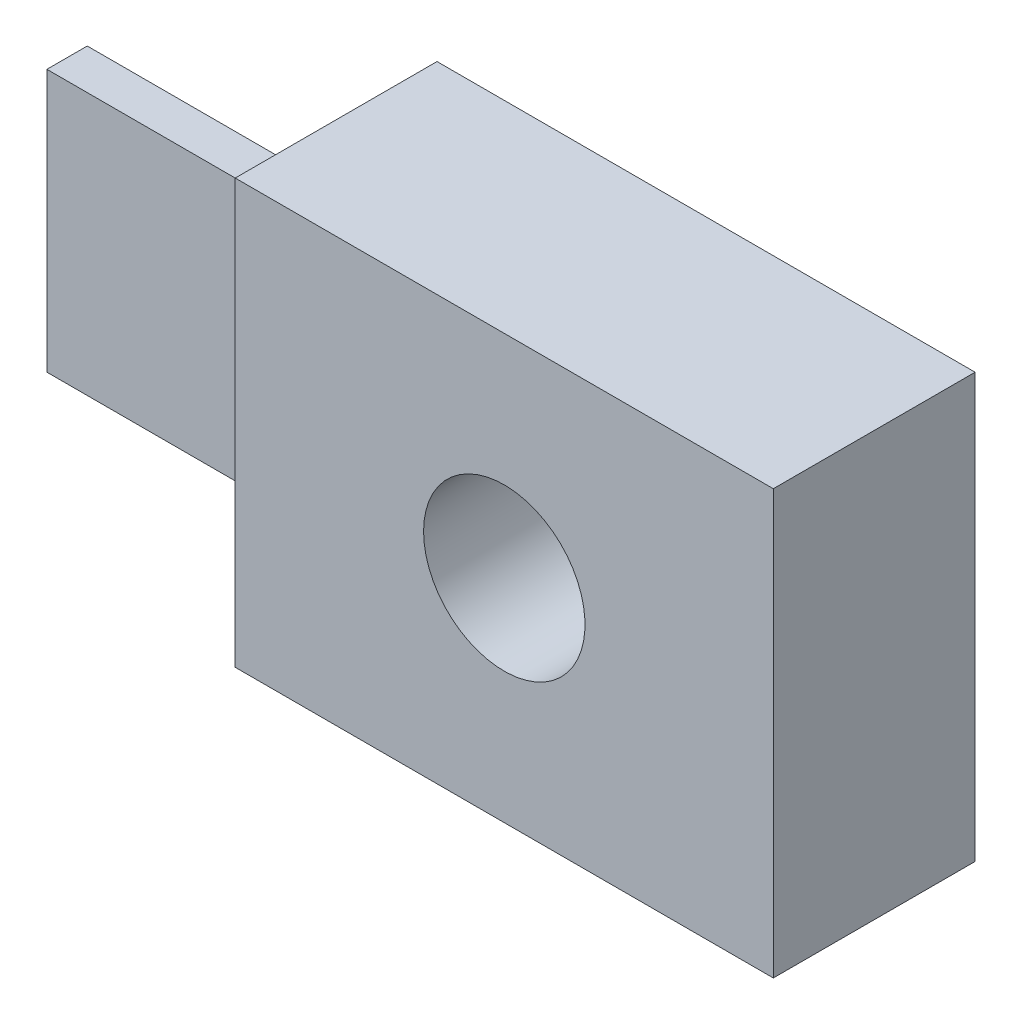
ISO-10303-21;
HEADER;
FILE_DESCRIPTION(('STEP AP214'),'2;1');
FILE_NAME('part.step','',(''),(''),'','','');
FILE_SCHEMA(('AUTOMOTIVE_DESIGN { 1 0 10303 214 1 1 1 1 }'));
ENDSEC;
DATA;
#1=APPLICATION_CONTEXT('core data for automotive mechanical design processes');
#2=APPLICATION_PROTOCOL_DEFINITION('international standard','automotive_design',2000,#1);
#3=PRODUCT_CONTEXT('',#1,'mechanical');
#4=PRODUCT('Part','Part','',(#3));
#5=PRODUCT_RELATED_PRODUCT_CATEGORY('part','',(#4));
#6=PRODUCT_DEFINITION_FORMATION('','',#4);
#7=PRODUCT_DEFINITION_CONTEXT('part definition',#1,'design');
#8=PRODUCT_DEFINITION('design','',#6,#7);
#9=PRODUCT_DEFINITION_SHAPE('','',#8);
#10=(LENGTH_UNIT() NAMED_UNIT(*) SI_UNIT(.MILLI.,.METRE.));
#11=(NAMED_UNIT(*) PLANE_ANGLE_UNIT() SI_UNIT($,.RADIAN.));
#12=(NAMED_UNIT(*) SI_UNIT($,.STERADIAN.) SOLID_ANGLE_UNIT());
#13=UNCERTAINTY_MEASURE_WITH_UNIT(LENGTH_MEASURE(1.E-05),#10,'distance_accuracy_value','');
#14=(GEOMETRIC_REPRESENTATION_CONTEXT(3) GLOBAL_UNCERTAINTY_ASSIGNED_CONTEXT((#13)) GLOBAL_UNIT_ASSIGNED_CONTEXT((#10,
#11,#12)) REPRESENTATION_CONTEXT('',''));
#15=CARTESIAN_POINT('',(0.,0.,0.));
#16=DIRECTION('',(0.,0.,1.));
#17=DIRECTION('',(1.,0.,0.));
#18=AXIS2_PLACEMENT_3D('',#15,#16,#17);
#19=CARTESIAN_POINT('',(-20.,-15.75,15.));
#20=DIRECTION('',(1.,0.,0.));
#21=DIRECTION('',(0.,0.,-1.));
#22=AXIS2_PLACEMENT_3D('',#19,#20,#21);
#23=PLANE('',#22);
#24=DIRECTION('',(0.,-1.,0.));
#25=VECTOR('',#24,1.);
#26=CARTESIAN_POINT('',(-20.,-15.75,0.));
#27=LINE('',#26,#25);
#28=CARTESIAN_POINT('',(-20.,15.75,0.));
#29=VERTEX_POINT('',#28);
#30=CARTESIAN_POINT('',(-20.,-15.75,0.));
#31=VERTEX_POINT('',#30);
#32=EDGE_CURVE('E144',#29,#31,#27,.T.);
#33=ORIENTED_EDGE('',*,*,#32,.T.);
#34=DIRECTION('',(0.,0.,-1.));
#35=VECTOR('',#34,1.);
#36=CARTESIAN_POINT('',(-20.,-15.75,15.));
#37=LINE('',#36,#35);
#38=CARTESIAN_POINT('',(-20.,-15.75,15.));
#39=VERTEX_POINT('',#38);
#40=EDGE_CURVE('E149',#39,#31,#37,.T.);
#41=ORIENTED_EDGE('',*,*,#40,.F.);
#42=DIRECTION('',(0.,-1.,0.));
#43=VECTOR('',#42,1.);
#44=CARTESIAN_POINT('',(-20.,-15.75,15.));
#45=LINE('',#44,#43);
#46=CARTESIAN_POINT('',(-20.,15.75,15.));
#47=VERTEX_POINT('',#46);
#48=EDGE_CURVE('E138',#47,#39,#45,.T.);
#49=ORIENTED_EDGE('',*,*,#48,.F.);
#50=DIRECTION('',(0.,0.,-1.));
#51=VECTOR('',#50,1.);
#52=CARTESIAN_POINT('',(-20.,15.75,15.));
#53=LINE('',#52,#51);
#54=EDGE_CURVE('E45',#47,#29,#53,.T.);
#55=ORIENTED_EDGE('',*,*,#54,.T.);
#56=EDGE_LOOP('',(#33,#41,#49,#55));
#57=FACE_BOUND('',#56,.T.);
#58=DIRECTION('',(0.,1.,0.));
#59=VECTOR('',#58,1.);
#60=CARTESIAN_POINT('',(-20.,-9.75,9.));
#61=LINE('',#60,#59);
#62=CARTESIAN_POINT('',(-20.,-9.75,9.));
#63=VERTEX_POINT('',#62);
#64=CARTESIAN_POINT('',(-20.,9.75,9.));
#65=VERTEX_POINT('',#64);
#66=EDGE_CURVE('E122',#63,#65,#61,.T.);
#67=ORIENTED_EDGE('',*,*,#66,.F.);
#68=DIRECTION('',(0.,0.,1.));
#69=VECTOR('',#68,1.);
#70=CARTESIAN_POINT('',(-20.,-9.75,6.));
#71=LINE('',#70,#69);
#72=CARTESIAN_POINT('',(-20.,-9.75,6.));
#73=VERTEX_POINT('',#72);
#74=EDGE_CURVE('E119',#73,#63,#71,.T.);
#75=ORIENTED_EDGE('',*,*,#74,.F.);
#76=DIRECTION('',(0.,-1.,0.));
#77=VECTOR('',#76,1.);
#78=CARTESIAN_POINT('',(-20.,-9.75,6.));
#79=LINE('',#78,#77);
#80=CARTESIAN_POINT('',(-20.,9.75,6.));
#81=VERTEX_POINT('',#80);
#82=EDGE_CURVE('E57',#81,#73,#79,.T.);
#83=ORIENTED_EDGE('',*,*,#82,.F.);
#84=DIRECTION('',(0.,0.,-1.));
#85=VECTOR('',#84,1.);
#86=CARTESIAN_POINT('',(-20.,9.75,6.));
#87=LINE('',#86,#85);
#88=EDGE_CURVE('E52',#65,#81,#87,.T.);
#89=ORIENTED_EDGE('',*,*,#88,.F.);
#90=EDGE_LOOP('',(#67,#75,#83,#89));
#91=FACE_BOUND('',#90,.T.);
#92=ADVANCED_FACE('F37',(#57,#91),#23,.F.);
#93=CARTESIAN_POINT('',(20.,-15.75,15.));
#94=DIRECTION('',(-1.,0.,0.));
#95=DIRECTION('',(0.,0.,1.));
#96=AXIS2_PLACEMENT_3D('',#93,#94,#95);
#97=PLANE('',#96);
#98=DIRECTION('',(0.,1.,0.));
#99=VECTOR('',#98,1.);
#100=CARTESIAN_POINT('',(20.,-15.75,0.));
#101=LINE('',#100,#99);
#102=CARTESIAN_POINT('',(20.,-15.75,0.));
#103=VERTEX_POINT('',#102);
#104=CARTESIAN_POINT('',(20.,15.75,0.));
#105=VERTEX_POINT('',#104);
#106=EDGE_CURVE('E123',#103,#105,#101,.T.);
#107=ORIENTED_EDGE('',*,*,#106,.T.);
#108=DIRECTION('',(0.,0.,-1.));
#109=VECTOR('',#108,1.);
#110=CARTESIAN_POINT('',(20.,15.75,15.));
#111=LINE('',#110,#109);
#112=CARTESIAN_POINT('',(20.,15.75,15.));
#113=VERTEX_POINT('',#112);
#114=EDGE_CURVE('E11',#113,#105,#111,.T.);
#115=ORIENTED_EDGE('',*,*,#114,.F.);
#116=DIRECTION('',(0.,1.,0.));
#117=VECTOR('',#116,1.);
#118=CARTESIAN_POINT('',(20.,-15.75,15.));
#119=LINE('',#118,#117);
#120=CARTESIAN_POINT('',(20.,-15.75,15.));
#121=VERTEX_POINT('',#120);
#122=EDGE_CURVE('E132',#121,#113,#119,.T.);
#123=ORIENTED_EDGE('',*,*,#122,.F.);
#124=DIRECTION('',(0.,0.,-1.));
#125=VECTOR('',#124,1.);
#126=CARTESIAN_POINT('',(20.,-15.75,15.));
#127=LINE('',#126,#125);
#128=EDGE_CURVE('E141',#121,#103,#127,.T.);
#129=ORIENTED_EDGE('',*,*,#128,.T.);
#130=EDGE_LOOP('',(#107,#115,#123,#129));
#131=FACE_BOUND('',#130,.T.);
#132=ADVANCED_FACE('F39',(#131),#97,.F.);
#133=CARTESIAN_POINT('',(-20.,15.75,15.));
#134=DIRECTION('',(0.,-1.,0.));
#135=DIRECTION('',(0.,0.,-1.));
#136=AXIS2_PLACEMENT_3D('',#133,#134,#135);
#137=PLANE('',#136);
#138=DIRECTION('',(-1.,0.,0.));
#139=VECTOR('',#138,1.);
#140=CARTESIAN_POINT('',(-20.,15.75,0.));
#141=LINE('',#140,#139);
#142=EDGE_CURVE('E126',#105,#29,#141,.T.);
#143=ORIENTED_EDGE('',*,*,#142,.T.);
#144=ORIENTED_EDGE('',*,*,#54,.F.);
#145=DIRECTION('',(-1.,0.,0.));
#146=VECTOR('',#145,1.);
#147=CARTESIAN_POINT('',(-20.,15.75,15.));
#148=LINE('',#147,#146);
#149=EDGE_CURVE('E135',#113,#47,#148,.T.);
#150=ORIENTED_EDGE('',*,*,#149,.F.);
#151=ORIENTED_EDGE('',*,*,#114,.T.);
#152=EDGE_LOOP('',(#143,#144,#150,#151));
#153=FACE_BOUND('',#152,.T.);
#154=ADVANCED_FACE('F171',(#153),#137,.F.);
#155=CARTESIAN_POINT('',(-20.,-15.75,15.));
#156=DIRECTION('',(0.,1.,0.));
#157=DIRECTION('',(0.,0.,1.));
#158=AXIS2_PLACEMENT_3D('',#155,#156,#157);
#159=PLANE('',#158);
#160=DIRECTION('',(1.,0.,0.));
#161=VECTOR('',#160,1.);
#162=CARTESIAN_POINT('',(-20.,-15.75,0.));
#163=LINE('',#162,#161);
#164=EDGE_CURVE('E136',#31,#103,#163,.T.);
#165=ORIENTED_EDGE('',*,*,#164,.T.);
#166=ORIENTED_EDGE('',*,*,#128,.F.);
#167=DIRECTION('',(1.,0.,0.));
#168=VECTOR('',#167,1.);
#169=CARTESIAN_POINT('',(-20.,-15.75,15.));
#170=LINE('',#169,#168);
#171=EDGE_CURVE('E140',#39,#121,#170,.T.);
#172=ORIENTED_EDGE('',*,*,#171,.F.);
#173=ORIENTED_EDGE('',*,*,#40,.T.);
#174=EDGE_LOOP('',(#165,#166,#172,#173));
#175=FACE_BOUND('',#174,.T.);
#176=ADVANCED_FACE('F164',(#175),#159,.F.);
#177=CARTESIAN_POINT('',(0.,0.,15.));
#178=DIRECTION('',(0.,0.,-1.));
#179=DIRECTION('',(-1.,0.,0.));
#180=AXIS2_PLACEMENT_3D('',#177,#178,#179);
#181=PLANE('',#180);
#182=CARTESIAN_POINT('',(0.,0.,15.));
#183=DIRECTION('',(0.,0.,-1.));
#184=DIRECTION('',(-1.,0.,0.));
#185=AXIS2_PLACEMENT_3D('',#182,#183,#184);
#186=CIRCLE('',#185,6.);
#187=CARTESIAN_POINT('',(-6.,0.,15.));
#188=VERTEX_POINT('',#187);
#189=EDGE_CURVE('E211',#188,#188,#186,.T.);
#190=ORIENTED_EDGE('',*,*,#189,.T.);
#191=EDGE_LOOP('',(#190));
#192=FACE_BOUND('',#191,.T.);
#193=ORIENTED_EDGE('',*,*,#122,.T.);
#194=ORIENTED_EDGE('',*,*,#149,.T.);
#195=ORIENTED_EDGE('',*,*,#48,.T.);
#196=ORIENTED_EDGE('',*,*,#171,.T.);
#197=EDGE_LOOP('',(#193,#194,#195,#196));
#198=FACE_BOUND('',#197,.T.);
#199=ADVANCED_FACE('F170',(#192,#198),#181,.F.);
#200=CARTESIAN_POINT('',(0.,0.,0.));
#201=DIRECTION('',(0.,0.,-1.));
#202=DIRECTION('',(-1.,0.,0.));
#203=AXIS2_PLACEMENT_3D('',#200,#201,#202);
#204=PLANE('',#203);
#205=CARTESIAN_POINT('',(0.,0.,0.));
#206=DIRECTION('',(0.,0.,-1.));
#207=DIRECTION('',(-1.,0.,0.));
#208=AXIS2_PLACEMENT_3D('',#205,#206,#207);
#209=CIRCLE('',#208,6.);
#210=CARTESIAN_POINT('',(-6.,0.,0.));
#211=VERTEX_POINT('',#210);
#212=EDGE_CURVE('E214',#211,#211,#209,.T.);
#213=ORIENTED_EDGE('',*,*,#212,.F.);
#214=EDGE_LOOP('',(#213));
#215=FACE_BOUND('',#214,.T.);
#216=ORIENTED_EDGE('',*,*,#106,.F.);
#217=ORIENTED_EDGE('',*,*,#164,.F.);
#218=ORIENTED_EDGE('',*,*,#32,.F.);
#219=ORIENTED_EDGE('',*,*,#142,.F.);
#220=EDGE_LOOP('',(#216,#217,#218,#219));
#221=FACE_BOUND('',#220,.T.);
#222=ADVANCED_FACE('F161',(#215,#221),#204,.T.);
#223=CARTESIAN_POINT('',(-40.,-9.75,9.));
#224=DIRECTION('',(0.,0.,-1.));
#225=DIRECTION('',(-1.,0.,0.));
#226=AXIS2_PLACEMENT_3D('',#223,#224,#225);
#227=PLANE('',#226);
#228=ORIENTED_EDGE('',*,*,#66,.T.);
#229=DIRECTION('',(1.,0.,0.));
#230=VECTOR('',#229,1.);
#231=CARTESIAN_POINT('',(-40.,9.75,9.));
#232=LINE('',#231,#230);
#233=CARTESIAN_POINT('',(-40.,9.75,9.));
#234=VERTEX_POINT('',#233);
#235=EDGE_CURVE('E103',#234,#65,#232,.T.);
#236=ORIENTED_EDGE('',*,*,#235,.F.);
#237=DIRECTION('',(0.,1.,0.));
#238=VECTOR('',#237,1.);
#239=CARTESIAN_POINT('',(-40.,-9.75,9.));
#240=LINE('',#239,#238);
#241=CARTESIAN_POINT('',(-40.,-9.75,9.));
#242=VERTEX_POINT('',#241);
#243=EDGE_CURVE('E110',#242,#234,#240,.T.);
#244=ORIENTED_EDGE('',*,*,#243,.F.);
#245=DIRECTION('',(1.,0.,0.));
#246=VECTOR('',#245,1.);
#247=CARTESIAN_POINT('',(-40.,-9.75,9.));
#248=LINE('',#247,#246);
#249=EDGE_CURVE('E220',#242,#63,#248,.T.);
#250=ORIENTED_EDGE('',*,*,#249,.T.);
#251=EDGE_LOOP('',(#228,#236,#244,#250));
#252=FACE_BOUND('',#251,.T.);
#253=ADVANCED_FACE('F121',(#252),#227,.F.);
#254=CARTESIAN_POINT('',(-40.,9.75,6.));
#255=DIRECTION('',(0.,-1.,0.));
#256=DIRECTION('',(0.,0.,-1.));
#257=AXIS2_PLACEMENT_3D('',#254,#255,#256);
#258=PLANE('',#257);
#259=ORIENTED_EDGE('',*,*,#88,.T.);
#260=DIRECTION('',(1.,0.,0.));
#261=VECTOR('',#260,1.);
#262=CARTESIAN_POINT('',(-40.,9.75,6.));
#263=LINE('',#262,#261);
#264=CARTESIAN_POINT('',(-40.,9.75,6.));
#265=VERTEX_POINT('',#264);
#266=EDGE_CURVE('E106',#265,#81,#263,.T.);
#267=ORIENTED_EDGE('',*,*,#266,.F.);
#268=DIRECTION('',(0.,0.,-1.));
#269=VECTOR('',#268,1.);
#270=CARTESIAN_POINT('',(-40.,9.75,6.));
#271=LINE('',#270,#269);
#272=EDGE_CURVE('E99',#234,#265,#271,.T.);
#273=ORIENTED_EDGE('',*,*,#272,.F.);
#274=ORIENTED_EDGE('',*,*,#235,.T.);
#275=EDGE_LOOP('',(#259,#267,#273,#274));
#276=FACE_BOUND('',#275,.T.);
#277=ADVANCED_FACE('F101',(#276),#258,.F.);
#278=CARTESIAN_POINT('',(-40.,-9.75,6.));
#279=DIRECTION('',(0.,0.,1.));
#280=DIRECTION('',(1.,0.,0.));
#281=AXIS2_PLACEMENT_3D('',#278,#279,#280);
#282=PLANE('',#281);
#283=ORIENTED_EDGE('',*,*,#82,.T.);
#284=DIRECTION('',(1.,0.,0.));
#285=VECTOR('',#284,1.);
#286=CARTESIAN_POINT('',(-40.,-9.75,6.));
#287=LINE('',#286,#285);
#288=CARTESIAN_POINT('',(-40.,-9.75,6.));
#289=VERTEX_POINT('',#288);
#290=EDGE_CURVE('E128',#289,#73,#287,.T.);
#291=ORIENTED_EDGE('',*,*,#290,.F.);
#292=DIRECTION('',(0.,-1.,0.));
#293=VECTOR('',#292,1.);
#294=CARTESIAN_POINT('',(-40.,-9.75,6.));
#295=LINE('',#294,#293);
#296=EDGE_CURVE('E109',#265,#289,#295,.T.);
#297=ORIENTED_EDGE('',*,*,#296,.F.);
#298=ORIENTED_EDGE('',*,*,#266,.T.);
#299=EDGE_LOOP('',(#283,#291,#297,#298));
#300=FACE_BOUND('',#299,.T.);
#301=ADVANCED_FACE('F193',(#300),#282,.F.);
#302=CARTESIAN_POINT('',(-40.,-9.75,6.));
#303=DIRECTION('',(0.,1.,0.));
#304=DIRECTION('',(0.,0.,1.));
#305=AXIS2_PLACEMENT_3D('',#302,#303,#304);
#306=PLANE('',#305);
#307=ORIENTED_EDGE('',*,*,#74,.T.);
#308=ORIENTED_EDGE('',*,*,#249,.F.);
#309=DIRECTION('',(0.,0.,1.));
#310=VECTOR('',#309,1.);
#311=CARTESIAN_POINT('',(-40.,-9.75,6.));
#312=LINE('',#311,#310);
#313=EDGE_CURVE('E115',#289,#242,#312,.T.);
#314=ORIENTED_EDGE('',*,*,#313,.F.);
#315=ORIENTED_EDGE('',*,*,#290,.T.);
#316=EDGE_LOOP('',(#307,#308,#314,#315));
#317=FACE_BOUND('',#316,.T.);
#318=ADVANCED_FACE('F196',(#317),#306,.F.);
#319=CARTESIAN_POINT('',(-40.,0.,0.));
#320=DIRECTION('',(1.,0.,0.));
#321=DIRECTION('',(0.,0.,-1.));
#322=AXIS2_PLACEMENT_3D('',#319,#320,#321);
#323=PLANE('',#322);
#324=ORIENTED_EDGE('',*,*,#243,.T.);
#325=ORIENTED_EDGE('',*,*,#272,.T.);
#326=ORIENTED_EDGE('',*,*,#296,.T.);
#327=ORIENTED_EDGE('',*,*,#313,.T.);
#328=EDGE_LOOP('',(#324,#325,#326,#327));
#329=FACE_BOUND('',#328,.T.);
#330=ADVANCED_FACE('F113',(#329),#323,.F.);
#331=CARTESIAN_POINT('',(0.,0.,15.));
#332=DIRECTION('',(0.,0.,-1.));
#333=DIRECTION('',(-1.,0.,0.));
#334=AXIS2_PLACEMENT_3D('',#331,#332,#333);
#335=CYLINDRICAL_SURFACE('',#334,6.);
#336=ORIENTED_EDGE('',*,*,#189,.F.);
#337=EDGE_LOOP('',(#336));
#338=FACE_BOUND('',#337,.T.);
#339=ORIENTED_EDGE('',*,*,#212,.T.);
#340=EDGE_LOOP('',(#339));
#341=FACE_BOUND('',#340,.T.);
#342=ADVANCED_FACE('F203',(#338,#341),#335,.F.);
#343=CLOSED_SHELL('',(#92,#132,#154,#176,#199,#222,#253,#277,#301,#318,#330,#342));
#344=MANIFOLD_SOLID_BREP('B2',#343);
#345=ADVANCED_BREP_SHAPE_REPRESENTATION('',(#18,#344),#14);
#346=SHAPE_DEFINITION_REPRESENTATION(#9,#345);
ENDSEC;
END-ISO-10303-21;
